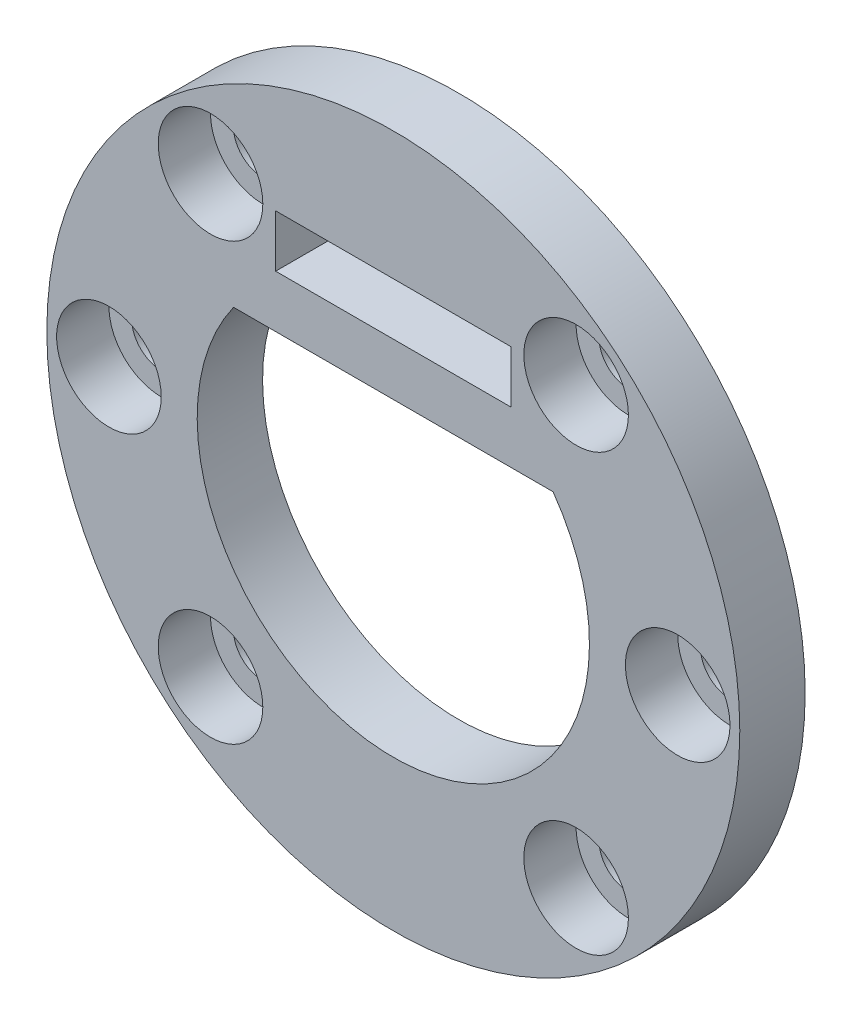
ISO-10303-21;
HEADER;
FILE_DESCRIPTION(('STEP AP214'),'2;1');
FILE_NAME('part.step','',(''),(''),'','','');
FILE_SCHEMA(('AUTOMOTIVE_DESIGN { 1 0 10303 214 1 1 1 1 }'));
ENDSEC;
DATA;
#1=APPLICATION_CONTEXT('core data for automotive mechanical design processes');
#2=APPLICATION_PROTOCOL_DEFINITION('international standard','automotive_design',2000,#1);
#3=PRODUCT_CONTEXT('',#1,'mechanical');
#4=PRODUCT('Part','Part','',(#3));
#5=PRODUCT_RELATED_PRODUCT_CATEGORY('part','',(#4));
#6=PRODUCT_DEFINITION_FORMATION('','',#4);
#7=PRODUCT_DEFINITION_CONTEXT('part definition',#1,'design');
#8=PRODUCT_DEFINITION('design','',#6,#7);
#9=PRODUCT_DEFINITION_SHAPE('','',#8);
#10=(LENGTH_UNIT() NAMED_UNIT(*) SI_UNIT(.MILLI.,.METRE.));
#11=(NAMED_UNIT(*) PLANE_ANGLE_UNIT() SI_UNIT($,.RADIAN.));
#12=(NAMED_UNIT(*) SI_UNIT($,.STERADIAN.) SOLID_ANGLE_UNIT());
#13=UNCERTAINTY_MEASURE_WITH_UNIT(LENGTH_MEASURE(1.E-05),#10,'distance_accuracy_value','');
#14=(GEOMETRIC_REPRESENTATION_CONTEXT(3) GLOBAL_UNCERTAINTY_ASSIGNED_CONTEXT((#13)) GLOBAL_UNIT_ASSIGNED_CONTEXT((#10,
#11,#12)) REPRESENTATION_CONTEXT('',''));
#15=CARTESIAN_POINT('',(0.,0.,0.));
#16=DIRECTION('',(0.,0.,1.));
#17=DIRECTION('',(1.,0.,0.));
#18=AXIS2_PLACEMENT_3D('',#15,#16,#17);
#19=CARTESIAN_POINT('',(0.,8.7,55.));
#20=DIRECTION('',(0.,-1.,0.));
#21=DIRECTION('',(0.,0.,-1.));
#22=AXIS2_PLACEMENT_3D('',#19,#20,#21);
#23=PLANE('',#22);
#24=DIRECTION('',(0.,0.,1.));
#25=VECTOR('',#24,1.);
#26=CARTESIAN_POINT('',(12.2192471126498,8.7,-5.));
#27=LINE('',#26,#25);
#28=CARTESIAN_POINT('',(12.2192471126498,8.7,0.));
#29=VERTEX_POINT('',#28);
#30=CARTESIAN_POINT('',(12.2192471126498,8.7,5.));
#31=VERTEX_POINT('',#30);
#32=EDGE_CURVE('E315',#29,#31,#27,.T.);
#33=ORIENTED_EDGE('',*,*,#32,.T.);
#34=DIRECTION('',(1.,0.,0.));
#35=VECTOR('',#34,1.);
#36=CARTESIAN_POINT('',(-48.,8.7,5.));
#37=LINE('',#36,#35);
#38=CARTESIAN_POINT('',(-12.2192471126498,8.7,5.));
#39=VERTEX_POINT('',#38);
#40=EDGE_CURVE('E304',#39,#31,#37,.T.);
#41=ORIENTED_EDGE('',*,*,#40,.F.);
#42=DIRECTION('',(0.,0.,1.));
#43=VECTOR('',#42,1.);
#44=CARTESIAN_POINT('',(-12.2192471126498,8.7,-5.));
#45=LINE('',#44,#43);
#46=CARTESIAN_POINT('',(-12.2192471126498,8.7,0.));
#47=VERTEX_POINT('',#46);
#48=EDGE_CURVE('E316',#47,#39,#45,.T.);
#49=ORIENTED_EDGE('',*,*,#48,.F.);
#50=DIRECTION('',(-1.,0.,0.));
#51=VECTOR('',#50,1.);
#52=CARTESIAN_POINT('',(0.,8.7,0.));
#53=LINE('',#52,#51);
#54=EDGE_CURVE('E424',#29,#47,#53,.T.);
#55=ORIENTED_EDGE('',*,*,#54,.F.);
#56=EDGE_LOOP('',(#33,#41,#49,#55));
#57=FACE_BOUND('',#56,.T.);
#58=ADVANCED_FACE('F219',(#57),#23,.T.);
#59=CARTESIAN_POINT('',(0.,0.,5.));
#60=DIRECTION('',(0.,0.,-1.));
#61=DIRECTION('',(-1.,0.,0.));
#62=AXIS2_PLACEMENT_3D('',#59,#60,#61);
#63=CYLINDRICAL_SURFACE('',#62,26.5);
#64=CARTESIAN_POINT('',(0.,0.,0.));
#65=DIRECTION('',(0.,0.,1.));
#66=DIRECTION('',(1.,0.,0.));
#67=AXIS2_PLACEMENT_3D('',#64,#65,#66);
#68=CIRCLE('',#67,26.5);
#69=CARTESIAN_POINT('',(26.5,0.,0.));
#70=VERTEX_POINT('',#69);
#71=EDGE_CURVE('E419',#70,#70,#68,.T.);
#72=ORIENTED_EDGE('',*,*,#71,.T.);
#73=EDGE_LOOP('',(#72));
#74=FACE_BOUND('',#73,.T.);
#75=CARTESIAN_POINT('',(0.,0.,5.));
#76=DIRECTION('',(0.,0.,1.));
#77=DIRECTION('',(1.,0.,0.));
#78=AXIS2_PLACEMENT_3D('',#75,#76,#77);
#79=CIRCLE('',#78,26.5);
#80=CARTESIAN_POINT('',(26.5,0.,5.));
#81=VERTEX_POINT('',#80);
#82=EDGE_CURVE('E420',#81,#81,#79,.T.);
#83=ORIENTED_EDGE('',*,*,#82,.F.);
#84=EDGE_LOOP('',(#83));
#85=FACE_BOUND('',#84,.T.);
#86=ADVANCED_FACE('F221',(#74,#85),#63,.T.);
#87=CARTESIAN_POINT('',(13.98063051,16.66146664,5.));
#88=DIRECTION('',(0.,0.,1.));
#89=DIRECTION('',(1.,0.,0.));
#90=AXIS2_PLACEMENT_3D('',#87,#88,#89);
#91=CYLINDRICAL_SURFACE('',#90,4.);
#92=CARTESIAN_POINT('',(13.98063051,16.66146664,1.));
#93=DIRECTION('',(0.,0.,1.));
#94=DIRECTION('',(1.,0.,0.));
#95=AXIS2_PLACEMENT_3D('',#92,#93,#94);
#96=CIRCLE('',#95,4.);
#97=CARTESIAN_POINT('',(17.98063051,16.66146664,1.));
#98=VERTEX_POINT('',#97);
#99=EDGE_CURVE('E343',#98,#98,#96,.T.);
#100=ORIENTED_EDGE('',*,*,#99,.F.);
#101=EDGE_LOOP('',(#100));
#102=FACE_BOUND('',#101,.T.);
#103=CARTESIAN_POINT('',(13.98063051,16.66146664,5.));
#104=DIRECTION('',(0.,0.,1.));
#105=DIRECTION('',(1.,0.,0.));
#106=AXIS2_PLACEMENT_3D('',#103,#104,#105);
#107=CIRCLE('',#106,4.);
#108=CARTESIAN_POINT('',(17.98063051,16.66146664,5.));
#109=VERTEX_POINT('',#108);
#110=EDGE_CURVE('E339',#109,#109,#107,.T.);
#111=ORIENTED_EDGE('',*,*,#110,.T.);
#112=EDGE_LOOP('',(#111));
#113=FACE_BOUND('',#112,.T.);
#114=ADVANCED_FACE('F468',(#102,#113),#91,.F.);
#115=CARTESIAN_POINT('',(-13.98063051,16.66146664,5.));
#116=DIRECTION('',(0.,0.,1.));
#117=DIRECTION('',(1.,0.,0.));
#118=AXIS2_PLACEMENT_3D('',#115,#116,#117);
#119=CYLINDRICAL_SURFACE('',#118,4.);
#120=CARTESIAN_POINT('',(-13.98063051,16.66146664,1.));
#121=DIRECTION('',(0.,0.,1.));
#122=DIRECTION('',(1.,0.,0.));
#123=AXIS2_PLACEMENT_3D('',#120,#121,#122);
#124=CIRCLE('',#123,4.);
#125=CARTESIAN_POINT('',(-9.98063051,16.66146664,1.));
#126=VERTEX_POINT('',#125);
#127=EDGE_CURVE('E327',#126,#126,#124,.T.);
#128=ORIENTED_EDGE('',*,*,#127,.F.);
#129=EDGE_LOOP('',(#128));
#130=FACE_BOUND('',#129,.T.);
#131=CARTESIAN_POINT('',(-13.98063051,16.66146664,5.));
#132=DIRECTION('',(0.,0.,1.));
#133=DIRECTION('',(1.,0.,0.));
#134=AXIS2_PLACEMENT_3D('',#131,#132,#133);
#135=CIRCLE('',#134,4.);
#136=CARTESIAN_POINT('',(-9.98063051,16.66146664,5.));
#137=VERTEX_POINT('',#136);
#138=EDGE_CURVE('E320',#137,#137,#135,.T.);
#139=ORIENTED_EDGE('',*,*,#138,.T.);
#140=EDGE_LOOP('',(#139));
#141=FACE_BOUND('',#140,.T.);
#142=ADVANCED_FACE('F471',(#130,#141),#119,.F.);
#143=CARTESIAN_POINT('',(0.,0.,5.));
#144=DIRECTION('',(0.,0.,1.));
#145=DIRECTION('',(1.,0.,0.));
#146=AXIS2_PLACEMENT_3D('',#143,#144,#145);
#147=PLANE('',#146);
#148=DIRECTION('',(-1.,0.,0.));
#149=VECTOR('',#148,1.);
#150=CARTESIAN_POINT('',(-9.,16.7,5.));
#151=LINE('',#150,#149);
#152=CARTESIAN_POINT('',(9.,16.7,5.));
#153=VERTEX_POINT('',#152);
#154=CARTESIAN_POINT('',(-9.,16.7,5.));
#155=VERTEX_POINT('',#154);
#156=EDGE_CURVE('E235',#153,#155,#151,.T.);
#157=ORIENTED_EDGE('',*,*,#156,.F.);
#158=DIRECTION('',(0.,1.,0.));
#159=VECTOR('',#158,1.);
#160=CARTESIAN_POINT('',(9.,16.7,5.));
#161=LINE('',#160,#159);
#162=CARTESIAN_POINT('',(9.,12.7,5.));
#163=VERTEX_POINT('',#162);
#164=EDGE_CURVE('E294',#163,#153,#161,.T.);
#165=ORIENTED_EDGE('',*,*,#164,.F.);
#166=DIRECTION('',(1.,0.,0.));
#167=VECTOR('',#166,1.);
#168=CARTESIAN_POINT('',(9.,12.7,5.));
#169=LINE('',#168,#167);
#170=CARTESIAN_POINT('',(-9.,12.7,5.));
#171=VERTEX_POINT('',#170);
#172=EDGE_CURVE('E276',#171,#163,#169,.T.);
#173=ORIENTED_EDGE('',*,*,#172,.F.);
#174=DIRECTION('',(0.,-1.,0.));
#175=VECTOR('',#174,1.);
#176=CARTESIAN_POINT('',(-9.,12.7,5.));
#177=LINE('',#176,#175);
#178=EDGE_CURVE('E286',#155,#171,#177,.T.);
#179=ORIENTED_EDGE('',*,*,#178,.F.);
#180=EDGE_LOOP('',(#157,#165,#173,#179));
#181=FACE_BOUND('',#180,.T.);
#182=ORIENTED_EDGE('',*,*,#138,.F.);
#183=EDGE_LOOP('',(#182));
#184=FACE_BOUND('',#183,.T.);
#185=ORIENTED_EDGE('',*,*,#110,.F.);
#186=EDGE_LOOP('',(#185));
#187=FACE_BOUND('',#186,.T.);
#188=ORIENTED_EDGE('',*,*,#82,.T.);
#189=EDGE_LOOP('',(#188));
#190=FACE_BOUND('',#189,.T.);
#191=CARTESIAN_POINT('',(0.,0.,5.));
#192=DIRECTION('',(0.,0.,1.));
#193=DIRECTION('',(1.,0.,0.));
#194=AXIS2_PLACEMENT_3D('',#191,#192,#193);
#195=CIRCLE('',#194,15.);
#196=EDGE_CURVE('E311',#39,#31,#195,.T.);
#197=ORIENTED_EDGE('',*,*,#196,.F.);
#198=ORIENTED_EDGE('',*,*,#40,.T.);
#199=EDGE_LOOP('',(#197,#198));
#200=FACE_BOUND('',#199,.T.);
#201=CARTESIAN_POINT('',(-21.75,0.,5.));
#202=DIRECTION('',(0.,0.,1.));
#203=DIRECTION('',(1.,0.,0.));
#204=AXIS2_PLACEMENT_3D('',#201,#202,#203);
#205=CIRCLE('',#204,4.);
#206=CARTESIAN_POINT('',(-17.75,0.,5.));
#207=VERTEX_POINT('',#206);
#208=EDGE_CURVE('E355',#207,#207,#205,.T.);
#209=ORIENTED_EDGE('',*,*,#208,.F.);
#210=EDGE_LOOP('',(#209));
#211=FACE_BOUND('',#210,.T.);
#212=CARTESIAN_POINT('',(-13.98063051,-16.66146664,5.));
#213=DIRECTION('',(0.,0.,1.));
#214=DIRECTION('',(1.,0.,0.));
#215=AXIS2_PLACEMENT_3D('',#212,#213,#214);
#216=CIRCLE('',#215,4.);
#217=CARTESIAN_POINT('',(-9.98063051,-16.66146664,5.));
#218=VERTEX_POINT('',#217);
#219=EDGE_CURVE('E371',#218,#218,#216,.T.);
#220=ORIENTED_EDGE('',*,*,#219,.F.);
#221=EDGE_LOOP('',(#220));
#222=FACE_BOUND('',#221,.T.);
#223=CARTESIAN_POINT('',(13.98063051,-16.66146664,5.));
#224=DIRECTION('',(0.,0.,1.));
#225=DIRECTION('',(1.,0.,0.));
#226=AXIS2_PLACEMENT_3D('',#223,#224,#225);
#227=CIRCLE('',#226,4.);
#228=CARTESIAN_POINT('',(17.98063051,-16.66146664,5.));
#229=VERTEX_POINT('',#228);
#230=EDGE_CURVE('E387',#229,#229,#227,.T.);
#231=ORIENTED_EDGE('',*,*,#230,.F.);
#232=EDGE_LOOP('',(#231));
#233=FACE_BOUND('',#232,.T.);
#234=CARTESIAN_POINT('',(21.75,0.,5.));
#235=DIRECTION('',(0.,0.,1.));
#236=DIRECTION('',(1.,0.,0.));
#237=AXIS2_PLACEMENT_3D('',#234,#235,#236);
#238=CIRCLE('',#237,4.);
#239=CARTESIAN_POINT('',(25.75,0.,5.));
#240=VERTEX_POINT('',#239);
#241=EDGE_CURVE('E403',#240,#240,#238,.T.);
#242=ORIENTED_EDGE('',*,*,#241,.F.);
#243=EDGE_LOOP('',(#242));
#244=FACE_BOUND('',#243,.T.);
#245=ADVANCED_FACE('F291',(#181,#184,#187,#190,#200,#211,#222,#233,#244),#147,.T.);
#246=CARTESIAN_POINT('',(0.,0.,0.));
#247=DIRECTION('',(0.,0.,1.));
#248=DIRECTION('',(1.,0.,0.));
#249=AXIS2_PLACEMENT_3D('',#246,#247,#248);
#250=PLANE('',#249);
#251=DIRECTION('',(0.,1.,0.));
#252=VECTOR('',#251,1.);
#253=CARTESIAN_POINT('',(9.,0.,0.));
#254=LINE('',#253,#252);
#255=CARTESIAN_POINT('',(9.,12.7,0.));
#256=VERTEX_POINT('',#255);
#257=CARTESIAN_POINT('',(9.,16.7,0.));
#258=VERTEX_POINT('',#257);
#259=EDGE_CURVE('E228',#256,#258,#254,.T.);
#260=ORIENTED_EDGE('',*,*,#259,.T.);
#261=DIRECTION('',(-1.,0.,0.));
#262=VECTOR('',#261,1.);
#263=CARTESIAN_POINT('',(0.,16.7,0.));
#264=LINE('',#263,#262);
#265=CARTESIAN_POINT('',(-9.,16.7,0.));
#266=VERTEX_POINT('',#265);
#267=EDGE_CURVE('E12',#258,#266,#264,.T.);
#268=ORIENTED_EDGE('',*,*,#267,.T.);
#269=DIRECTION('',(0.,-1.,0.));
#270=VECTOR('',#269,1.);
#271=CARTESIAN_POINT('',(-9.,0.,0.));
#272=LINE('',#271,#270);
#273=CARTESIAN_POINT('',(-9.,12.7,0.));
#274=VERTEX_POINT('',#273);
#275=EDGE_CURVE('E435',#266,#274,#272,.T.);
#276=ORIENTED_EDGE('',*,*,#275,.T.);
#277=DIRECTION('',(1.,0.,0.));
#278=VECTOR('',#277,1.);
#279=CARTESIAN_POINT('',(0.,12.7,0.));
#280=LINE('',#279,#278);
#281=EDGE_CURVE('E279',#274,#256,#280,.T.);
#282=ORIENTED_EDGE('',*,*,#281,.T.);
#283=EDGE_LOOP('',(#260,#268,#276,#282));
#284=FACE_BOUND('',#283,.T.);
#285=ORIENTED_EDGE('',*,*,#54,.T.);
#286=CARTESIAN_POINT('',(0.,0.,0.));
#287=DIRECTION('',(0.,0.,1.));
#288=DIRECTION('',(1.,0.,0.));
#289=AXIS2_PLACEMENT_3D('',#286,#287,#288);
#290=CIRCLE('',#289,15.);
#291=EDGE_CURVE('E431',#47,#29,#290,.T.);
#292=ORIENTED_EDGE('',*,*,#291,.T.);
#293=EDGE_LOOP('',(#285,#292));
#294=FACE_BOUND('',#293,.T.);
#295=CARTESIAN_POINT('',(-13.98063051,16.66146664,0.));
#296=DIRECTION('',(0.,0.,1.));
#297=DIRECTION('',(1.,0.,0.));
#298=AXIS2_PLACEMENT_3D('',#295,#296,#297);
#299=CIRCLE('',#298,2.25);
#300=CARTESIAN_POINT('',(-11.73063051,16.66146664,0.));
#301=VERTEX_POINT('',#300);
#302=EDGE_CURVE('E335',#301,#301,#299,.T.);
#303=ORIENTED_EDGE('',*,*,#302,.T.);
#304=EDGE_LOOP('',(#303));
#305=FACE_BOUND('',#304,.T.);
#306=CARTESIAN_POINT('',(13.98063051,16.66146664,0.));
#307=DIRECTION('',(0.,0.,1.));
#308=DIRECTION('',(1.,0.,0.));
#309=AXIS2_PLACEMENT_3D('',#306,#307,#308);
#310=CIRCLE('',#309,2.25);
#311=CARTESIAN_POINT('',(16.23063051,16.66146664,0.));
#312=VERTEX_POINT('',#311);
#313=EDGE_CURVE('E351',#312,#312,#310,.T.);
#314=ORIENTED_EDGE('',*,*,#313,.T.);
#315=EDGE_LOOP('',(#314));
#316=FACE_BOUND('',#315,.T.);
#317=CARTESIAN_POINT('',(-21.75,0.,0.));
#318=DIRECTION('',(0.,0.,1.));
#319=DIRECTION('',(1.,0.,0.));
#320=AXIS2_PLACEMENT_3D('',#317,#318,#319);
#321=CIRCLE('',#320,2.25);
#322=CARTESIAN_POINT('',(-19.5,0.,0.));
#323=VERTEX_POINT('',#322);
#324=EDGE_CURVE('E367',#323,#323,#321,.T.);
#325=ORIENTED_EDGE('',*,*,#324,.T.);
#326=EDGE_LOOP('',(#325));
#327=FACE_BOUND('',#326,.T.);
#328=CARTESIAN_POINT('',(-13.98063051,-16.66146664,0.));
#329=DIRECTION('',(0.,0.,1.));
#330=DIRECTION('',(1.,0.,0.));
#331=AXIS2_PLACEMENT_3D('',#328,#329,#330);
#332=CIRCLE('',#331,2.25);
#333=CARTESIAN_POINT('',(-11.73063051,-16.66146664,0.));
#334=VERTEX_POINT('',#333);
#335=EDGE_CURVE('E383',#334,#334,#332,.T.);
#336=ORIENTED_EDGE('',*,*,#335,.T.);
#337=EDGE_LOOP('',(#336));
#338=FACE_BOUND('',#337,.T.);
#339=CARTESIAN_POINT('',(13.98063051,-16.66146664,0.));
#340=DIRECTION('',(0.,0.,1.));
#341=DIRECTION('',(1.,0.,0.));
#342=AXIS2_PLACEMENT_3D('',#339,#340,#341);
#343=CIRCLE('',#342,2.25);
#344=CARTESIAN_POINT('',(16.23063051,-16.66146664,0.));
#345=VERTEX_POINT('',#344);
#346=EDGE_CURVE('E399',#345,#345,#343,.T.);
#347=ORIENTED_EDGE('',*,*,#346,.T.);
#348=EDGE_LOOP('',(#347));
#349=FACE_BOUND('',#348,.T.);
#350=CARTESIAN_POINT('',(21.75,0.,0.));
#351=DIRECTION('',(0.,0.,1.));
#352=DIRECTION('',(1.,0.,0.));
#353=AXIS2_PLACEMENT_3D('',#350,#351,#352);
#354=CIRCLE('',#353,2.25);
#355=CARTESIAN_POINT('',(24.,0.,0.));
#356=VERTEX_POINT('',#355);
#357=EDGE_CURVE('E415',#356,#356,#354,.T.);
#358=ORIENTED_EDGE('',*,*,#357,.T.);
#359=EDGE_LOOP('',(#358));
#360=FACE_BOUND('',#359,.T.);
#361=ORIENTED_EDGE('',*,*,#71,.F.);
#362=EDGE_LOOP('',(#361));
#363=FACE_BOUND('',#362,.T.);
#364=ADVANCED_FACE('F442',(#284,#294,#305,#316,#327,#338,#349,#360,#363),#250,.F.);
#365=CARTESIAN_POINT('',(21.75,0.,5.));
#366=DIRECTION('',(0.,0.,1.));
#367=DIRECTION('',(1.,0.,0.));
#368=AXIS2_PLACEMENT_3D('',#365,#366,#367);
#369=CYLINDRICAL_SURFACE('',#368,2.25);
#370=ORIENTED_EDGE('',*,*,#357,.F.);
#371=EDGE_LOOP('',(#370));
#372=FACE_BOUND('',#371,.T.);
#373=CARTESIAN_POINT('',(21.75,0.,1.));
#374=DIRECTION('',(0.,0.,1.));
#375=DIRECTION('',(1.,0.,0.));
#376=AXIS2_PLACEMENT_3D('',#373,#374,#375);
#377=CIRCLE('',#376,2.25);
#378=CARTESIAN_POINT('',(24.,0.,1.));
#379=VERTEX_POINT('',#378);
#380=EDGE_CURVE('E411',#379,#379,#377,.T.);
#381=ORIENTED_EDGE('',*,*,#380,.T.);
#382=EDGE_LOOP('',(#381));
#383=FACE_BOUND('',#382,.T.);
#384=ADVANCED_FACE('F536',(#372,#383),#369,.F.);
#385=CARTESIAN_POINT('',(24.,0.,1.));
#386=DIRECTION('',(0.,0.,-1.));
#387=DIRECTION('',(-1.,0.,0.));
#388=AXIS2_PLACEMENT_3D('',#385,#386,#387);
#389=PLANE('',#388);
#390=ORIENTED_EDGE('',*,*,#380,.F.);
#391=EDGE_LOOP('',(#390));
#392=FACE_BOUND('',#391,.T.);
#393=CARTESIAN_POINT('',(21.75,0.,1.));
#394=DIRECTION('',(0.,0.,1.));
#395=DIRECTION('',(1.,0.,0.));
#396=AXIS2_PLACEMENT_3D('',#393,#394,#395);
#397=CIRCLE('',#396,4.);
#398=CARTESIAN_POINT('',(25.75,0.,1.));
#399=VERTEX_POINT('',#398);
#400=EDGE_CURVE('E407',#399,#399,#397,.T.);
#401=ORIENTED_EDGE('',*,*,#400,.T.);
#402=EDGE_LOOP('',(#401));
#403=FACE_BOUND('',#402,.T.);
#404=ADVANCED_FACE('F532',(#392,#403),#389,.F.);
#405=CARTESIAN_POINT('',(21.75,0.,5.));
#406=DIRECTION('',(0.,0.,1.));
#407=DIRECTION('',(1.,0.,0.));
#408=AXIS2_PLACEMENT_3D('',#405,#406,#407);
#409=CYLINDRICAL_SURFACE('',#408,4.);
#410=ORIENTED_EDGE('',*,*,#400,.F.);
#411=EDGE_LOOP('',(#410));
#412=FACE_BOUND('',#411,.T.);
#413=ORIENTED_EDGE('',*,*,#241,.T.);
#414=EDGE_LOOP('',(#413));
#415=FACE_BOUND('',#414,.T.);
#416=ADVANCED_FACE('F528',(#412,#415),#409,.F.);
#417=CARTESIAN_POINT('',(13.98063051,-16.66146664,5.));
#418=DIRECTION('',(0.,0.,1.));
#419=DIRECTION('',(1.,0.,0.));
#420=AXIS2_PLACEMENT_3D('',#417,#418,#419);
#421=CYLINDRICAL_SURFACE('',#420,2.25);
#422=ORIENTED_EDGE('',*,*,#346,.F.);
#423=EDGE_LOOP('',(#422));
#424=FACE_BOUND('',#423,.T.);
#425=CARTESIAN_POINT('',(13.98063051,-16.66146664,1.));
#426=DIRECTION('',(0.,0.,1.));
#427=DIRECTION('',(1.,0.,0.));
#428=AXIS2_PLACEMENT_3D('',#425,#426,#427);
#429=CIRCLE('',#428,2.25);
#430=CARTESIAN_POINT('',(16.23063051,-16.66146664,1.));
#431=VERTEX_POINT('',#430);
#432=EDGE_CURVE('E395',#431,#431,#429,.T.);
#433=ORIENTED_EDGE('',*,*,#432,.T.);
#434=EDGE_LOOP('',(#433));
#435=FACE_BOUND('',#434,.T.);
#436=ADVANCED_FACE('F524',(#424,#435),#421,.F.);
#437=CARTESIAN_POINT('',(16.23063051,-16.66146664,1.));
#438=DIRECTION('',(0.,0.,-1.));
#439=DIRECTION('',(-1.,0.,0.));
#440=AXIS2_PLACEMENT_3D('',#437,#438,#439);
#441=PLANE('',#440);
#442=ORIENTED_EDGE('',*,*,#432,.F.);
#443=EDGE_LOOP('',(#442));
#444=FACE_BOUND('',#443,.T.);
#445=CARTESIAN_POINT('',(13.98063051,-16.66146664,1.));
#446=DIRECTION('',(0.,0.,1.));
#447=DIRECTION('',(1.,0.,0.));
#448=AXIS2_PLACEMENT_3D('',#445,#446,#447);
#449=CIRCLE('',#448,4.);
#450=CARTESIAN_POINT('',(17.98063051,-16.66146664,1.));
#451=VERTEX_POINT('',#450);
#452=EDGE_CURVE('E391',#451,#451,#449,.T.);
#453=ORIENTED_EDGE('',*,*,#452,.T.);
#454=EDGE_LOOP('',(#453));
#455=FACE_BOUND('',#454,.T.);
#456=ADVANCED_FACE('F520',(#444,#455),#441,.F.);
#457=CARTESIAN_POINT('',(13.98063051,-16.66146664,5.));
#458=DIRECTION('',(0.,0.,1.));
#459=DIRECTION('',(1.,0.,0.));
#460=AXIS2_PLACEMENT_3D('',#457,#458,#459);
#461=CYLINDRICAL_SURFACE('',#460,4.);
#462=ORIENTED_EDGE('',*,*,#452,.F.);
#463=EDGE_LOOP('',(#462));
#464=FACE_BOUND('',#463,.T.);
#465=ORIENTED_EDGE('',*,*,#230,.T.);
#466=EDGE_LOOP('',(#465));
#467=FACE_BOUND('',#466,.T.);
#468=ADVANCED_FACE('F516',(#464,#467),#461,.F.);
#469=CARTESIAN_POINT('',(-13.98063051,-16.66146664,5.));
#470=DIRECTION('',(0.,0.,1.));
#471=DIRECTION('',(1.,0.,0.));
#472=AXIS2_PLACEMENT_3D('',#469,#470,#471);
#473=CYLINDRICAL_SURFACE('',#472,2.25);
#474=ORIENTED_EDGE('',*,*,#335,.F.);
#475=EDGE_LOOP('',(#474));
#476=FACE_BOUND('',#475,.T.);
#477=CARTESIAN_POINT('',(-13.98063051,-16.66146664,1.));
#478=DIRECTION('',(0.,0.,1.));
#479=DIRECTION('',(1.,0.,0.));
#480=AXIS2_PLACEMENT_3D('',#477,#478,#479);
#481=CIRCLE('',#480,2.25);
#482=CARTESIAN_POINT('',(-11.73063051,-16.66146664,1.));
#483=VERTEX_POINT('',#482);
#484=EDGE_CURVE('E379',#483,#483,#481,.T.);
#485=ORIENTED_EDGE('',*,*,#484,.T.);
#486=EDGE_LOOP('',(#485));
#487=FACE_BOUND('',#486,.T.);
#488=ADVANCED_FACE('F512',(#476,#487),#473,.F.);
#489=CARTESIAN_POINT('',(-11.73063051,-16.66146664,1.));
#490=DIRECTION('',(0.,0.,-1.));
#491=DIRECTION('',(-1.,0.,0.));
#492=AXIS2_PLACEMENT_3D('',#489,#490,#491);
#493=PLANE('',#492);
#494=ORIENTED_EDGE('',*,*,#484,.F.);
#495=EDGE_LOOP('',(#494));
#496=FACE_BOUND('',#495,.T.);
#497=CARTESIAN_POINT('',(-13.98063051,-16.66146664,1.));
#498=DIRECTION('',(0.,0.,1.));
#499=DIRECTION('',(1.,0.,0.));
#500=AXIS2_PLACEMENT_3D('',#497,#498,#499);
#501=CIRCLE('',#500,4.);
#502=CARTESIAN_POINT('',(-9.98063051,-16.66146664,1.));
#503=VERTEX_POINT('',#502);
#504=EDGE_CURVE('E375',#503,#503,#501,.T.);
#505=ORIENTED_EDGE('',*,*,#504,.T.);
#506=EDGE_LOOP('',(#505));
#507=FACE_BOUND('',#506,.T.);
#508=ADVANCED_FACE('F508',(#496,#507),#493,.F.);
#509=CARTESIAN_POINT('',(-13.98063051,-16.66146664,5.));
#510=DIRECTION('',(0.,0.,1.));
#511=DIRECTION('',(1.,0.,0.));
#512=AXIS2_PLACEMENT_3D('',#509,#510,#511);
#513=CYLINDRICAL_SURFACE('',#512,4.);
#514=ORIENTED_EDGE('',*,*,#504,.F.);
#515=EDGE_LOOP('',(#514));
#516=FACE_BOUND('',#515,.T.);
#517=ORIENTED_EDGE('',*,*,#219,.T.);
#518=EDGE_LOOP('',(#517));
#519=FACE_BOUND('',#518,.T.);
#520=ADVANCED_FACE('F504',(#516,#519),#513,.F.);
#521=CARTESIAN_POINT('',(-21.75,0.,5.));
#522=DIRECTION('',(0.,0.,1.));
#523=DIRECTION('',(1.,0.,0.));
#524=AXIS2_PLACEMENT_3D('',#521,#522,#523);
#525=CYLINDRICAL_SURFACE('',#524,2.25);
#526=ORIENTED_EDGE('',*,*,#324,.F.);
#527=EDGE_LOOP('',(#526));
#528=FACE_BOUND('',#527,.T.);
#529=CARTESIAN_POINT('',(-21.75,0.,1.));
#530=DIRECTION('',(0.,0.,1.));
#531=DIRECTION('',(1.,0.,0.));
#532=AXIS2_PLACEMENT_3D('',#529,#530,#531);
#533=CIRCLE('',#532,2.25);
#534=CARTESIAN_POINT('',(-19.5,0.,1.));
#535=VERTEX_POINT('',#534);
#536=EDGE_CURVE('E363',#535,#535,#533,.T.);
#537=ORIENTED_EDGE('',*,*,#536,.T.);
#538=EDGE_LOOP('',(#537));
#539=FACE_BOUND('',#538,.T.);
#540=ADVANCED_FACE('F500',(#528,#539),#525,.F.);
#541=CARTESIAN_POINT('',(-19.5,0.,1.));
#542=DIRECTION('',(0.,0.,-1.));
#543=DIRECTION('',(-1.,0.,0.));
#544=AXIS2_PLACEMENT_3D('',#541,#542,#543);
#545=PLANE('',#544);
#546=ORIENTED_EDGE('',*,*,#536,.F.);
#547=EDGE_LOOP('',(#546));
#548=FACE_BOUND('',#547,.T.);
#549=CARTESIAN_POINT('',(-21.75,0.,1.));
#550=DIRECTION('',(0.,0.,1.));
#551=DIRECTION('',(1.,0.,0.));
#552=AXIS2_PLACEMENT_3D('',#549,#550,#551);
#553=CIRCLE('',#552,4.);
#554=CARTESIAN_POINT('',(-17.75,0.,1.));
#555=VERTEX_POINT('',#554);
#556=EDGE_CURVE('E359',#555,#555,#553,.T.);
#557=ORIENTED_EDGE('',*,*,#556,.T.);
#558=EDGE_LOOP('',(#557));
#559=FACE_BOUND('',#558,.T.);
#560=ADVANCED_FACE('F496',(#548,#559),#545,.F.);
#561=CARTESIAN_POINT('',(-21.75,0.,5.));
#562=DIRECTION('',(0.,0.,1.));
#563=DIRECTION('',(1.,0.,0.));
#564=AXIS2_PLACEMENT_3D('',#561,#562,#563);
#565=CYLINDRICAL_SURFACE('',#564,4.);
#566=ORIENTED_EDGE('',*,*,#556,.F.);
#567=EDGE_LOOP('',(#566));
#568=FACE_BOUND('',#567,.T.);
#569=ORIENTED_EDGE('',*,*,#208,.T.);
#570=EDGE_LOOP('',(#569));
#571=FACE_BOUND('',#570,.T.);
#572=ADVANCED_FACE('F492',(#568,#571),#565,.F.);
#573=CARTESIAN_POINT('',(13.98063051,16.66146664,5.));
#574=DIRECTION('',(0.,0.,1.));
#575=DIRECTION('',(1.,0.,0.));
#576=AXIS2_PLACEMENT_3D('',#573,#574,#575);
#577=CYLINDRICAL_SURFACE('',#576,2.25);
#578=ORIENTED_EDGE('',*,*,#313,.F.);
#579=EDGE_LOOP('',(#578));
#580=FACE_BOUND('',#579,.T.);
#581=CARTESIAN_POINT('',(13.98063051,16.66146664,1.));
#582=DIRECTION('',(0.,0.,1.));
#583=DIRECTION('',(1.,0.,0.));
#584=AXIS2_PLACEMENT_3D('',#581,#582,#583);
#585=CIRCLE('',#584,2.25);
#586=CARTESIAN_POINT('',(16.23063051,16.66146664,1.));
#587=VERTEX_POINT('',#586);
#588=EDGE_CURVE('E347',#587,#587,#585,.T.);
#589=ORIENTED_EDGE('',*,*,#588,.T.);
#590=EDGE_LOOP('',(#589));
#591=FACE_BOUND('',#590,.T.);
#592=ADVANCED_FACE('F488',(#580,#591),#577,.F.);
#593=CARTESIAN_POINT('',(16.23063051,16.66146664,1.));
#594=DIRECTION('',(0.,0.,-1.));
#595=DIRECTION('',(-1.,0.,0.));
#596=AXIS2_PLACEMENT_3D('',#593,#594,#595);
#597=PLANE('',#596);
#598=ORIENTED_EDGE('',*,*,#588,.F.);
#599=EDGE_LOOP('',(#598));
#600=FACE_BOUND('',#599,.T.);
#601=ORIENTED_EDGE('',*,*,#99,.T.);
#602=EDGE_LOOP('',(#601));
#603=FACE_BOUND('',#602,.T.);
#604=ADVANCED_FACE('F481',(#600,#603),#597,.F.);
#605=CARTESIAN_POINT('',(-13.98063051,16.66146664,5.));
#606=DIRECTION('',(0.,0.,1.));
#607=DIRECTION('',(1.,0.,0.));
#608=AXIS2_PLACEMENT_3D('',#605,#606,#607);
#609=CYLINDRICAL_SURFACE('',#608,2.25);
#610=ORIENTED_EDGE('',*,*,#302,.F.);
#611=EDGE_LOOP('',(#610));
#612=FACE_BOUND('',#611,.T.);
#613=CARTESIAN_POINT('',(-13.98063051,16.66146664,1.));
#614=DIRECTION('',(0.,0.,1.));
#615=DIRECTION('',(1.,0.,0.));
#616=AXIS2_PLACEMENT_3D('',#613,#614,#615);
#617=CIRCLE('',#616,2.25);
#618=CARTESIAN_POINT('',(-11.73063051,16.66146664,1.));
#619=VERTEX_POINT('',#618);
#620=EDGE_CURVE('E331',#619,#619,#617,.T.);
#621=ORIENTED_EDGE('',*,*,#620,.T.);
#622=EDGE_LOOP('',(#621));
#623=FACE_BOUND('',#622,.T.);
#624=ADVANCED_FACE('F477',(#612,#623),#609,.F.);
#625=CARTESIAN_POINT('',(-11.73063051,16.66146664,1.));
#626=DIRECTION('',(0.,0.,-1.));
#627=DIRECTION('',(-1.,0.,0.));
#628=AXIS2_PLACEMENT_3D('',#625,#626,#627);
#629=PLANE('',#628);
#630=ORIENTED_EDGE('',*,*,#620,.F.);
#631=EDGE_LOOP('',(#630));
#632=FACE_BOUND('',#631,.T.);
#633=ORIENTED_EDGE('',*,*,#127,.T.);
#634=EDGE_LOOP('',(#633));
#635=FACE_BOUND('',#634,.T.);
#636=ADVANCED_FACE('F457',(#632,#635),#629,.F.);
#637=CARTESIAN_POINT('',(0.,0.,-5.));
#638=DIRECTION('',(0.,0.,1.));
#639=DIRECTION('',(1.,0.,0.));
#640=AXIS2_PLACEMENT_3D('',#637,#638,#639);
#641=CYLINDRICAL_SURFACE('',#640,15.);
#642=ORIENTED_EDGE('',*,*,#48,.T.);
#643=ORIENTED_EDGE('',*,*,#196,.T.);
#644=ORIENTED_EDGE('',*,*,#32,.F.);
#645=ORIENTED_EDGE('',*,*,#291,.F.);
#646=EDGE_LOOP('',(#642,#643,#644,#645));
#647=FACE_BOUND('',#646,.T.);
#648=ADVANCED_FACE('F449',(#647),#641,.F.);
#649=CARTESIAN_POINT('',(-9.,16.7,-5.));
#650=DIRECTION('',(0.,1.,0.));
#651=DIRECTION('',(0.,0.,1.));
#652=AXIS2_PLACEMENT_3D('',#649,#650,#651);
#653=PLANE('',#652);
#654=DIRECTION('',(0.,0.,1.));
#655=VECTOR('',#654,1.);
#656=CARTESIAN_POINT('',(9.,16.7,-5.));
#657=LINE('',#656,#655);
#658=EDGE_CURVE('E301',#258,#153,#657,.T.);
#659=ORIENTED_EDGE('',*,*,#658,.T.);
#660=ORIENTED_EDGE('',*,*,#156,.T.);
#661=DIRECTION('',(0.,0.,1.));
#662=VECTOR('',#661,1.);
#663=CARTESIAN_POINT('',(-9.,16.7,-5.));
#664=LINE('',#663,#662);
#665=EDGE_CURVE('E283',#266,#155,#664,.T.);
#666=ORIENTED_EDGE('',*,*,#665,.F.);
#667=ORIENTED_EDGE('',*,*,#267,.F.);
#668=EDGE_LOOP('',(#659,#660,#666,#667));
#669=FACE_BOUND('',#668,.T.);
#670=ADVANCED_FACE('F447',(#669),#653,.F.);
#671=CARTESIAN_POINT('',(9.,16.7,-5.));
#672=DIRECTION('',(1.,0.,0.));
#673=DIRECTION('',(0.,0.,-1.));
#674=AXIS2_PLACEMENT_3D('',#671,#672,#673);
#675=PLANE('',#674);
#676=DIRECTION('',(0.,0.,1.));
#677=VECTOR('',#676,1.);
#678=CARTESIAN_POINT('',(9.,12.7,-5.));
#679=LINE('',#678,#677);
#680=EDGE_CURVE('E282',#256,#163,#679,.T.);
#681=ORIENTED_EDGE('',*,*,#680,.T.);
#682=ORIENTED_EDGE('',*,*,#164,.T.);
#683=ORIENTED_EDGE('',*,*,#658,.F.);
#684=ORIENTED_EDGE('',*,*,#259,.F.);
#685=EDGE_LOOP('',(#681,#682,#683,#684));
#686=FACE_BOUND('',#685,.T.);
#687=ADVANCED_FACE('F446',(#686),#675,.F.);
#688=CARTESIAN_POINT('',(9.,12.7,-5.));
#689=DIRECTION('',(0.,-1.,0.));
#690=DIRECTION('',(0.,0.,-1.));
#691=AXIS2_PLACEMENT_3D('',#688,#689,#690);
#692=PLANE('',#691);
#693=DIRECTION('',(0.,0.,1.));
#694=VECTOR('',#693,1.);
#695=CARTESIAN_POINT('',(-9.,12.7,-5.));
#696=LINE('',#695,#694);
#697=EDGE_CURVE('E243',#274,#171,#696,.T.);
#698=ORIENTED_EDGE('',*,*,#697,.T.);
#699=ORIENTED_EDGE('',*,*,#172,.T.);
#700=ORIENTED_EDGE('',*,*,#680,.F.);
#701=ORIENTED_EDGE('',*,*,#281,.F.);
#702=EDGE_LOOP('',(#698,#699,#700,#701));
#703=FACE_BOUND('',#702,.T.);
#704=ADVANCED_FACE('F273',(#703),#692,.F.);
#705=CARTESIAN_POINT('',(-9.,12.7,-5.));
#706=DIRECTION('',(-1.,0.,0.));
#707=DIRECTION('',(0.,0.,1.));
#708=AXIS2_PLACEMENT_3D('',#705,#706,#707);
#709=PLANE('',#708);
#710=ORIENTED_EDGE('',*,*,#665,.T.);
#711=ORIENTED_EDGE('',*,*,#178,.T.);
#712=ORIENTED_EDGE('',*,*,#697,.F.);
#713=ORIENTED_EDGE('',*,*,#275,.F.);
#714=EDGE_LOOP('',(#710,#711,#712,#713));
#715=FACE_BOUND('',#714,.T.);
#716=ADVANCED_FACE('F287',(#715),#709,.F.);
#717=CLOSED_SHELL('',(#58,#86,#114,#142,#245,#364,#384,#404,#416,#436,#456,#468,#488,#508,#520,
#540,#560,#572,#592,#604,#624,#636,#648,#670,#687,#704,#716));
#718=MANIFOLD_SOLID_BREP('B2',#717);
#719=ADVANCED_BREP_SHAPE_REPRESENTATION('',(#18,#718),#14);
#720=SHAPE_DEFINITION_REPRESENTATION(#9,#719);
ENDSEC;
END-ISO-10303-21;
